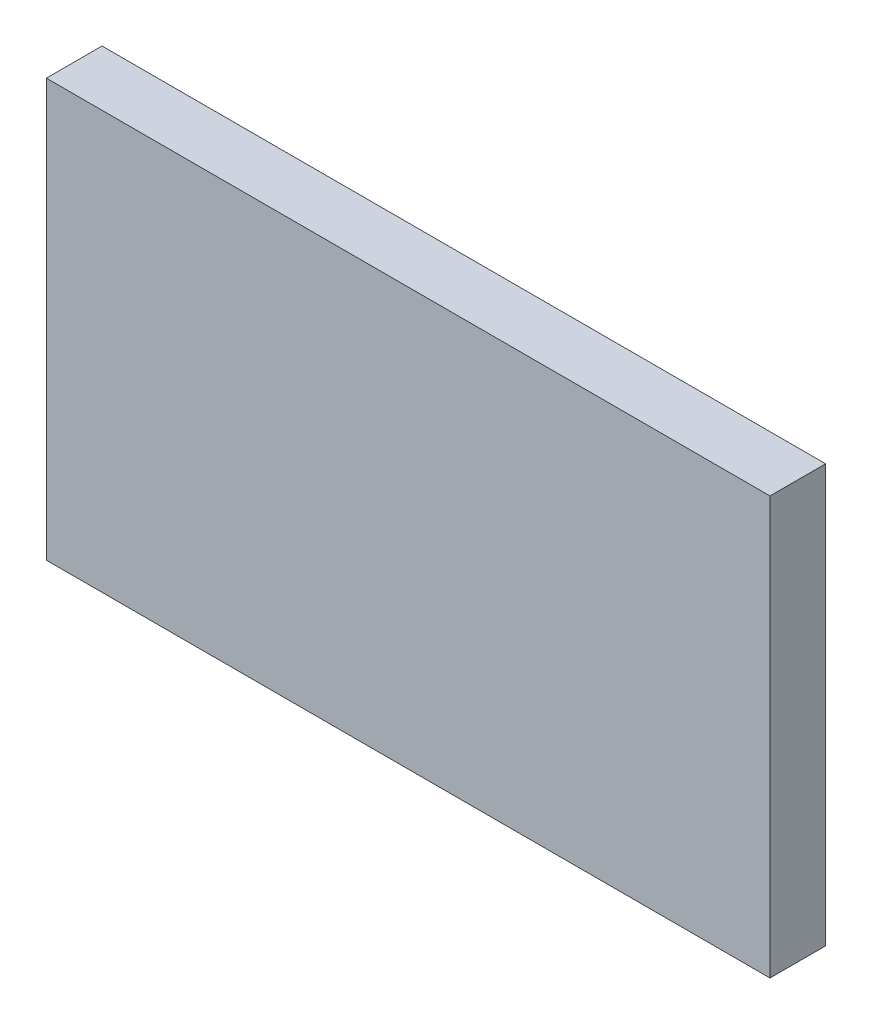
ISO-10303-21;
HEADER;
FILE_DESCRIPTION(('STEP AP214'),'2;1');
FILE_NAME('part.step','',(''),(''),'','','');
FILE_SCHEMA(('AUTOMOTIVE_DESIGN { 1 0 10303 214 1 1 1 1 }'));
ENDSEC;
DATA;
#1=APPLICATION_CONTEXT('core data for automotive mechanical design processes');
#2=APPLICATION_PROTOCOL_DEFINITION('international standard','automotive_design',2000,#1);
#3=PRODUCT_CONTEXT('',#1,'mechanical');
#4=PRODUCT('Part','Part','',(#3));
#5=PRODUCT_RELATED_PRODUCT_CATEGORY('part','',(#4));
#6=PRODUCT_DEFINITION_FORMATION('','',#4);
#7=PRODUCT_DEFINITION_CONTEXT('part definition',#1,'design');
#8=PRODUCT_DEFINITION('design','',#6,#7);
#9=PRODUCT_DEFINITION_SHAPE('','',#8);
#10=(LENGTH_UNIT() NAMED_UNIT(*) SI_UNIT(.MILLI.,.METRE.));
#11=(NAMED_UNIT(*) PLANE_ANGLE_UNIT() SI_UNIT($,.RADIAN.));
#12=(NAMED_UNIT(*) SI_UNIT($,.STERADIAN.) SOLID_ANGLE_UNIT());
#13=UNCERTAINTY_MEASURE_WITH_UNIT(LENGTH_MEASURE(1.E-05),#10,'distance_accuracy_value','');
#14=(GEOMETRIC_REPRESENTATION_CONTEXT(3) GLOBAL_UNCERTAINTY_ASSIGNED_CONTEXT((#13)) GLOBAL_UNIT_ASSIGNED_CONTEXT((#10,
#11,#12)) REPRESENTATION_CONTEXT('',''));
#15=CARTESIAN_POINT('',(0.,0.,0.));
#16=DIRECTION('',(0.,0.,1.));
#17=DIRECTION('',(1.,0.,0.));
#18=AXIS2_PLACEMENT_3D('',#15,#16,#17);
#19=CARTESIAN_POINT('',(0.,75.,0.));
#20=DIRECTION('',(-1.,0.,0.));
#21=DIRECTION('',(0.,0.,1.));
#22=AXIS2_PLACEMENT_3D('',#19,#20,#21);
#23=PLANE('',#22);
#24=DIRECTION('',(0.,0.,-1.));
#25=VECTOR('',#24,1.);
#26=CARTESIAN_POINT('',(0.,0.,0.));
#27=LINE('',#26,#25);
#28=CARTESIAN_POINT('',(0.,0.,0.));
#29=VERTEX_POINT('',#28);
#30=CARTESIAN_POINT('',(0.,0.,-10.));
#31=VERTEX_POINT('',#30);
#32=EDGE_CURVE('E95',#29,#31,#27,.T.);
#33=ORIENTED_EDGE('',*,*,#32,.T.);
#34=DIRECTION('',(0.,-1.,0.));
#35=VECTOR('',#34,1.);
#36=CARTESIAN_POINT('',(0.,75.,-10.));
#37=LINE('',#36,#35);
#38=CARTESIAN_POINT('',(0.,75.,-10.));
#39=VERTEX_POINT('',#38);
#40=EDGE_CURVE('E11',#39,#31,#37,.T.);
#41=ORIENTED_EDGE('',*,*,#40,.F.);
#42=DIRECTION('',(0.,0.,-1.));
#43=VECTOR('',#42,1.);
#44=CARTESIAN_POINT('',(0.,75.,0.));
#45=LINE('',#44,#43);
#46=CARTESIAN_POINT('',(0.,75.,0.));
#47=VERTEX_POINT('',#46);
#48=EDGE_CURVE('E83',#47,#39,#45,.T.);
#49=ORIENTED_EDGE('',*,*,#48,.F.);
#50=DIRECTION('',(0.,-1.,0.));
#51=VECTOR('',#50,1.);
#52=CARTESIAN_POINT('',(0.,75.,0.));
#53=LINE('',#52,#51);
#54=EDGE_CURVE('E91',#47,#29,#53,.T.);
#55=ORIENTED_EDGE('',*,*,#54,.T.);
#56=EDGE_LOOP('',(#33,#41,#49,#55));
#57=FACE_BOUND('',#56,.T.);
#58=ADVANCED_FACE('F32',(#57),#23,.F.);
#59=CARTESIAN_POINT('',(0.,75.,-10.));
#60=DIRECTION('',(0.,0.,1.));
#61=DIRECTION('',(1.,0.,0.));
#62=AXIS2_PLACEMENT_3D('',#59,#60,#61);
#63=PLANE('',#62);
#64=DIRECTION('',(-1.,0.,0.));
#65=VECTOR('',#64,1.);
#66=CARTESIAN_POINT('',(0.,0.,-10.));
#67=LINE('',#66,#65);
#68=CARTESIAN_POINT('',(-130.,0.,-9.99999999999999));
#69=VERTEX_POINT('',#68);
#70=EDGE_CURVE('E87',#31,#69,#67,.T.);
#71=ORIENTED_EDGE('',*,*,#70,.T.);
#72=DIRECTION('',(0.,-1.,0.));
#73=VECTOR('',#72,1.);
#74=CARTESIAN_POINT('',(-130.,75.,-9.99999999999999));
#75=LINE('',#74,#73);
#76=CARTESIAN_POINT('',(-130.,75.,-9.99999999999999));
#77=VERTEX_POINT('',#76);
#78=EDGE_CURVE('E40',#77,#69,#75,.T.);
#79=ORIENTED_EDGE('',*,*,#78,.F.);
#80=DIRECTION('',(-1.,0.,0.));
#81=VECTOR('',#80,1.);
#82=CARTESIAN_POINT('',(0.,75.,-10.));
#83=LINE('',#82,#81);
#84=EDGE_CURVE('E78',#39,#77,#83,.T.);
#85=ORIENTED_EDGE('',*,*,#84,.F.);
#86=ORIENTED_EDGE('',*,*,#40,.T.);
#87=EDGE_LOOP('',(#71,#79,#85,#86));
#88=FACE_BOUND('',#87,.T.);
#89=ADVANCED_FACE('F86',(#88),#63,.F.);
#90=CARTESIAN_POINT('',(-130.,75.,0.));
#91=DIRECTION('',(1.,0.,0.));
#92=DIRECTION('',(0.,0.,-1.));
#93=AXIS2_PLACEMENT_3D('',#90,#91,#92);
#94=PLANE('',#93);
#95=DIRECTION('',(0.,0.,1.));
#96=VECTOR('',#95,1.);
#97=CARTESIAN_POINT('',(-130.,0.,0.));
#98=LINE('',#97,#96);
#99=CARTESIAN_POINT('',(-130.,0.,0.));
#100=VERTEX_POINT('',#99);
#101=EDGE_CURVE('E65',#69,#100,#98,.T.);
#102=ORIENTED_EDGE('',*,*,#101,.T.);
#103=DIRECTION('',(0.,-1.,0.));
#104=VECTOR('',#103,1.);
#105=CARTESIAN_POINT('',(-130.,75.,0.));
#106=LINE('',#105,#104);
#107=CARTESIAN_POINT('',(-130.,75.,0.));
#108=VERTEX_POINT('',#107);
#109=EDGE_CURVE('E88',#108,#100,#106,.T.);
#110=ORIENTED_EDGE('',*,*,#109,.F.);
#111=DIRECTION('',(0.,0.,1.));
#112=VECTOR('',#111,1.);
#113=CARTESIAN_POINT('',(-130.,75.,0.));
#114=LINE('',#113,#112);
#115=EDGE_CURVE('E81',#77,#108,#114,.T.);
#116=ORIENTED_EDGE('',*,*,#115,.F.);
#117=ORIENTED_EDGE('',*,*,#78,.T.);
#118=EDGE_LOOP('',(#102,#110,#116,#117));
#119=FACE_BOUND('',#118,.T.);
#120=ADVANCED_FACE('F89',(#119),#94,.F.);
#121=CARTESIAN_POINT('',(0.,75.,0.));
#122=DIRECTION('',(0.,0.,-1.));
#123=DIRECTION('',(-1.,0.,0.));
#124=AXIS2_PLACEMENT_3D('',#121,#122,#123);
#125=PLANE('',#124);
#126=DIRECTION('',(1.,0.,0.));
#127=VECTOR('',#126,1.);
#128=CARTESIAN_POINT('',(0.,0.,0.));
#129=LINE('',#128,#127);
#130=EDGE_CURVE('E71',#100,#29,#129,.T.);
#131=ORIENTED_EDGE('',*,*,#130,.T.);
#132=ORIENTED_EDGE('',*,*,#54,.F.);
#133=DIRECTION('',(1.,0.,0.));
#134=VECTOR('',#133,1.);
#135=CARTESIAN_POINT('',(0.,75.,0.));
#136=LINE('',#135,#134);
#137=EDGE_CURVE('E48',#108,#47,#136,.T.);
#138=ORIENTED_EDGE('',*,*,#137,.F.);
#139=ORIENTED_EDGE('',*,*,#109,.T.);
#140=EDGE_LOOP('',(#131,#132,#138,#139));
#141=FACE_BOUND('',#140,.T.);
#142=ADVANCED_FACE('F102',(#141),#125,.F.);
#143=CARTESIAN_POINT('',(0.,75.,0.));
#144=DIRECTION('',(0.,1.,0.));
#145=DIRECTION('',(0.,0.,1.));
#146=AXIS2_PLACEMENT_3D('',#143,#144,#145);
#147=PLANE('',#146);
#148=ORIENTED_EDGE('',*,*,#48,.T.);
#149=ORIENTED_EDGE('',*,*,#84,.T.);
#150=ORIENTED_EDGE('',*,*,#115,.T.);
#151=ORIENTED_EDGE('',*,*,#137,.T.);
#152=EDGE_LOOP('',(#148,#149,#150,#151));
#153=FACE_BOUND('',#152,.T.);
#154=ADVANCED_FACE('F79',(#153),#147,.T.);
#155=CARTESIAN_POINT('',(0.,0.,0.));
#156=DIRECTION('',(0.,1.,0.));
#157=DIRECTION('',(0.,0.,1.));
#158=AXIS2_PLACEMENT_3D('',#155,#156,#157);
#159=PLANE('',#158);
#160=ORIENTED_EDGE('',*,*,#32,.F.);
#161=ORIENTED_EDGE('',*,*,#130,.F.);
#162=ORIENTED_EDGE('',*,*,#101,.F.);
#163=ORIENTED_EDGE('',*,*,#70,.F.);
#164=EDGE_LOOP('',(#160,#161,#162,#163));
#165=FACE_BOUND('',#164,.T.);
#166=ADVANCED_FACE('F105',(#165),#159,.F.);
#167=CLOSED_SHELL('',(#58,#89,#120,#142,#154,#166));
#168=MANIFOLD_SOLID_BREP('B2',#167);
#169=ADVANCED_BREP_SHAPE_REPRESENTATION('',(#18,#168),#14);
#170=SHAPE_DEFINITION_REPRESENTATION(#9,#169);
ENDSEC;
END-ISO-10303-21;
